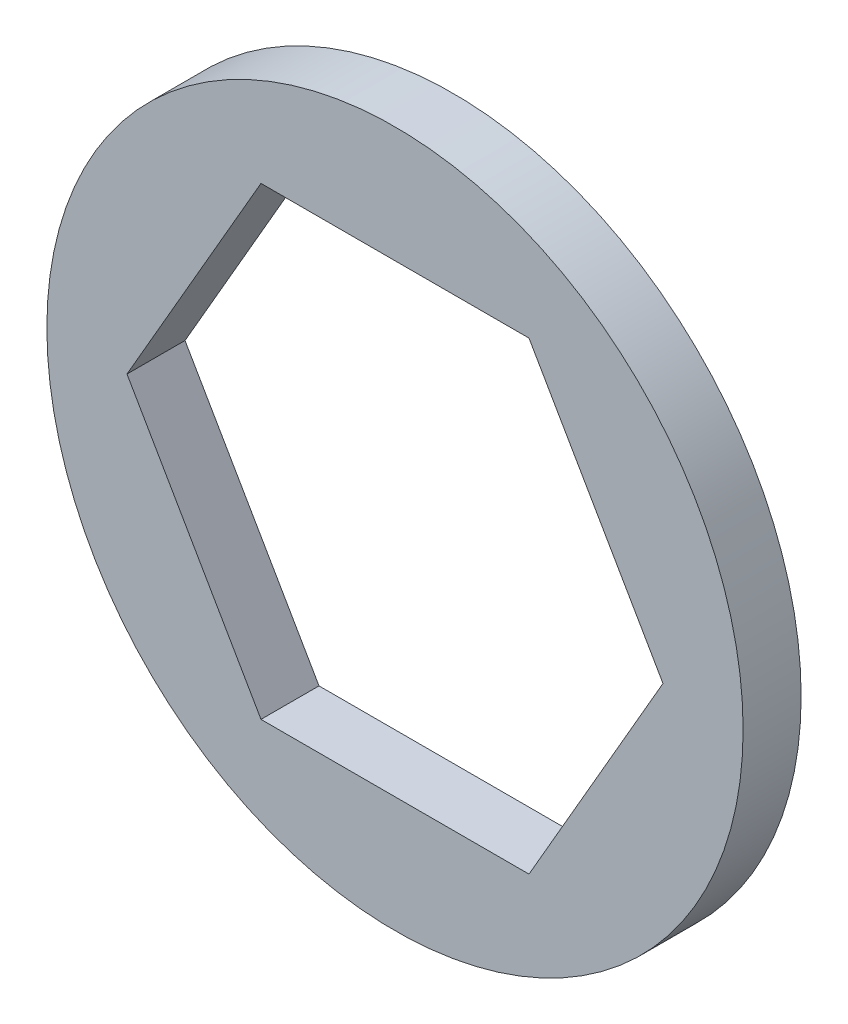
ISO-10303-21;
HEADER;
FILE_DESCRIPTION(('STEP AP214'),'2;1');
FILE_NAME('part.step','',(''),(''),'','','');
FILE_SCHEMA(('AUTOMOTIVE_DESIGN { 1 0 10303 214 1 1 1 1 }'));
ENDSEC;
DATA;
#1=APPLICATION_CONTEXT('core data for automotive mechanical design processes');
#2=APPLICATION_PROTOCOL_DEFINITION('international standard','automotive_design',2000,#1);
#3=PRODUCT_CONTEXT('',#1,'mechanical');
#4=PRODUCT('Part','Part','',(#3));
#5=PRODUCT_RELATED_PRODUCT_CATEGORY('part','',(#4));
#6=PRODUCT_DEFINITION_FORMATION('','',#4);
#7=PRODUCT_DEFINITION_CONTEXT('part definition',#1,'design');
#8=PRODUCT_DEFINITION('design','',#6,#7);
#9=PRODUCT_DEFINITION_SHAPE('','',#8);
#10=(LENGTH_UNIT() NAMED_UNIT(*) SI_UNIT(.MILLI.,.METRE.));
#11=(NAMED_UNIT(*) PLANE_ANGLE_UNIT() SI_UNIT($,.RADIAN.));
#12=(NAMED_UNIT(*) SI_UNIT($,.STERADIAN.) SOLID_ANGLE_UNIT());
#13=UNCERTAINTY_MEASURE_WITH_UNIT(LENGTH_MEASURE(1.E-05),#10,'distance_accuracy_value','');
#14=(GEOMETRIC_REPRESENTATION_CONTEXT(3) GLOBAL_UNCERTAINTY_ASSIGNED_CONTEXT((#13)) GLOBAL_UNIT_ASSIGNED_CONTEXT((#10,
#11,#12)) REPRESENTATION_CONTEXT('',''));
#15=CARTESIAN_POINT('',(0.,0.,0.));
#16=DIRECTION('',(0.,0.,1.));
#17=DIRECTION('',(1.,0.,0.));
#18=AXIS2_PLACEMENT_3D('',#15,#16,#17);
#19=CARTESIAN_POINT('',(0.,0.,1.5875));
#20=DIRECTION('',(0.,0.,1.));
#21=DIRECTION('',(1.,0.,0.));
#22=AXIS2_PLACEMENT_3D('',#19,#20,#21);
#23=PLANE('',#22);
#24=CARTESIAN_POINT('',(0.,0.,1.5875));
#25=DIRECTION('',(0.,0.,1.));
#26=DIRECTION('',(1.,0.,0.));
#27=AXIS2_PLACEMENT_3D('',#24,#25,#26);
#28=CIRCLE('',#27,9.525);
#29=CARTESIAN_POINT('',(9.525,0.,1.5875));
#30=VERTEX_POINT('',#29);
#31=EDGE_CURVE('E12',#30,#30,#28,.T.);
#32=ORIENTED_EDGE('',*,*,#31,.T.);
#33=EDGE_LOOP('',(#32));
#34=FACE_BOUND('',#33,.T.);
#35=DIRECTION('',(0.5,0.866025403784439,0.));
#36=VECTOR('',#35,1.);
#37=CARTESIAN_POINT('',(5.49926131403119,-3.175,1.5875));
#38=LINE('',#37,#36);
#39=CARTESIAN_POINT('',(3.66617420935413,-6.35,1.5875));
#40=VERTEX_POINT('',#39);
#41=CARTESIAN_POINT('',(7.33234841870825,0.,1.5875));
#42=VERTEX_POINT('',#41);
#43=EDGE_CURVE('E133',#40,#42,#38,.T.);
#44=ORIENTED_EDGE('',*,*,#43,.F.);
#45=DIRECTION('',(1.,0.,0.));
#46=VECTOR('',#45,1.);
#47=CARTESIAN_POINT('',(0.,-6.35,1.5875));
#48=LINE('',#47,#46);
#49=CARTESIAN_POINT('',(-3.66617420935412,-6.35,1.5875));
#50=VERTEX_POINT('',#49);
#51=EDGE_CURVE('E124',#50,#40,#48,.T.);
#52=ORIENTED_EDGE('',*,*,#51,.F.);
#53=DIRECTION('',(0.5,-0.866025403784439,0.));
#54=VECTOR('',#53,1.);
#55=CARTESIAN_POINT('',(-5.49926131403118,-3.175,1.5875));
#56=LINE('',#55,#54);
#57=CARTESIAN_POINT('',(-7.33234841870825,0.,1.5875));
#58=VERTEX_POINT('',#57);
#59=EDGE_CURVE('E158',#58,#50,#56,.T.);
#60=ORIENTED_EDGE('',*,*,#59,.F.);
#61=DIRECTION('',(-0.5,-0.866025403784439,0.));
#62=VECTOR('',#61,1.);
#63=CARTESIAN_POINT('',(-5.49926131403118,3.175,1.5875));
#64=LINE('',#63,#62);
#65=CARTESIAN_POINT('',(-3.66617420935412,6.35,1.5875));
#66=VERTEX_POINT('',#65);
#67=EDGE_CURVE('E155',#66,#58,#64,.T.);
#68=ORIENTED_EDGE('',*,*,#67,.F.);
#69=DIRECTION('',(-1.,0.,0.));
#70=VECTOR('',#69,1.);
#71=CARTESIAN_POINT('',(0.,6.35,1.5875));
#72=LINE('',#71,#70);
#73=CARTESIAN_POINT('',(3.66617420935412,6.35,1.5875));
#74=VERTEX_POINT('',#73);
#75=EDGE_CURVE('E150',#74,#66,#72,.T.);
#76=ORIENTED_EDGE('',*,*,#75,.F.);
#77=DIRECTION('',(-0.5,0.866025403784439,0.));
#78=VECTOR('',#77,1.);
#79=CARTESIAN_POINT('',(5.49926131403118,3.175,1.5875));
#80=LINE('',#79,#78);
#81=EDGE_CURVE('E146',#42,#74,#80,.T.);
#82=ORIENTED_EDGE('',*,*,#81,.F.);
#83=EDGE_LOOP('',(#44,#52,#60,#68,#76,#82));
#84=FACE_BOUND('',#83,.T.);
#85=ADVANCED_FACE('F70',(#34,#84),#23,.T.);
#86=CARTESIAN_POINT('',(0.,0.,0.));
#87=DIRECTION('',(0.,0.,1.));
#88=DIRECTION('',(1.,0.,0.));
#89=AXIS2_PLACEMENT_3D('',#86,#87,#88);
#90=PLANE('',#89);
#91=CARTESIAN_POINT('',(0.,0.,0.));
#92=DIRECTION('',(0.,0.,1.));
#93=DIRECTION('',(1.,0.,0.));
#94=AXIS2_PLACEMENT_3D('',#91,#92,#93);
#95=CIRCLE('',#94,9.525);
#96=CARTESIAN_POINT('',(9.525,0.,0.));
#97=VERTEX_POINT('',#96);
#98=EDGE_CURVE('E74',#97,#97,#95,.T.);
#99=ORIENTED_EDGE('',*,*,#98,.F.);
#100=EDGE_LOOP('',(#99));
#101=FACE_BOUND('',#100,.T.);
#102=DIRECTION('',(1.,0.,0.));
#103=VECTOR('',#102,1.);
#104=CARTESIAN_POINT('',(0.,-6.35,0.));
#105=LINE('',#104,#103);
#106=CARTESIAN_POINT('',(-3.66617420935412,-6.35,0.));
#107=VERTEX_POINT('',#106);
#108=CARTESIAN_POINT('',(3.66617420935413,-6.35,0.));
#109=VERTEX_POINT('',#108);
#110=EDGE_CURVE('E94',#107,#109,#105,.T.);
#111=ORIENTED_EDGE('',*,*,#110,.T.);
#112=DIRECTION('',(0.5,0.866025403784439,0.));
#113=VECTOR('',#112,1.);
#114=CARTESIAN_POINT('',(5.49926131403119,-3.175,0.));
#115=LINE('',#114,#113);
#116=CARTESIAN_POINT('',(7.33234841870825,0.,0.));
#117=VERTEX_POINT('',#116);
#118=EDGE_CURVE('E140',#109,#117,#115,.T.);
#119=ORIENTED_EDGE('',*,*,#118,.T.);
#120=DIRECTION('',(-0.5,0.866025403784439,0.));
#121=VECTOR('',#120,1.);
#122=CARTESIAN_POINT('',(5.49926131403118,3.175,0.));
#123=LINE('',#122,#121);
#124=CARTESIAN_POINT('',(3.66617420935412,6.35,0.));
#125=VERTEX_POINT('',#124);
#126=EDGE_CURVE('E165',#117,#125,#123,.T.);
#127=ORIENTED_EDGE('',*,*,#126,.T.);
#128=DIRECTION('',(-1.,0.,0.));
#129=VECTOR('',#128,1.);
#130=CARTESIAN_POINT('',(0.,6.35,0.));
#131=LINE('',#130,#129);
#132=CARTESIAN_POINT('',(-3.66617420935412,6.35,0.));
#133=VERTEX_POINT('',#132);
#134=EDGE_CURVE('E169',#125,#133,#131,.T.);
#135=ORIENTED_EDGE('',*,*,#134,.T.);
#136=DIRECTION('',(-0.5,-0.866025403784439,0.));
#137=VECTOR('',#136,1.);
#138=CARTESIAN_POINT('',(-5.49926131403118,3.175,0.));
#139=LINE('',#138,#137);
#140=CARTESIAN_POINT('',(-7.33234841870825,0.,0.));
#141=VERTEX_POINT('',#140);
#142=EDGE_CURVE('E173',#133,#141,#139,.T.);
#143=ORIENTED_EDGE('',*,*,#142,.T.);
#144=DIRECTION('',(0.5,-0.866025403784439,0.));
#145=VECTOR('',#144,1.);
#146=CARTESIAN_POINT('',(-5.49926131403118,-3.175,0.));
#147=LINE('',#146,#145);
#148=EDGE_CURVE('E134',#141,#107,#147,.T.);
#149=ORIENTED_EDGE('',*,*,#148,.T.);
#150=EDGE_LOOP('',(#111,#119,#127,#135,#143,#149));
#151=FACE_BOUND('',#150,.T.);
#152=ADVANCED_FACE('F197',(#101,#151),#90,.F.);
#153=CARTESIAN_POINT('',(0.,0.,1.5875));
#154=DIRECTION('',(0.,0.,-1.));
#155=DIRECTION('',(-1.,0.,0.));
#156=AXIS2_PLACEMENT_3D('',#153,#154,#155);
#157=CYLINDRICAL_SURFACE('',#156,9.525);
#158=ORIENTED_EDGE('',*,*,#31,.F.);
#159=EDGE_LOOP('',(#158));
#160=FACE_BOUND('',#159,.T.);
#161=ORIENTED_EDGE('',*,*,#98,.T.);
#162=EDGE_LOOP('',(#161));
#163=FACE_BOUND('',#162,.T.);
#164=ADVANCED_FACE('F72',(#160,#163),#157,.T.);
#165=CARTESIAN_POINT('',(0.,-6.35,1.5875));
#166=DIRECTION('',(0.,1.,0.));
#167=DIRECTION('',(0.,0.,1.));
#168=AXIS2_PLACEMENT_3D('',#165,#166,#167);
#169=PLANE('',#168);
#170=ORIENTED_EDGE('',*,*,#110,.F.);
#171=DIRECTION('',(0.,0.,-1.));
#172=VECTOR('',#171,1.);
#173=CARTESIAN_POINT('',(-3.66617420935412,-6.35,1.5875));
#174=LINE('',#173,#172);
#175=EDGE_CURVE('E128',#50,#107,#174,.T.);
#176=ORIENTED_EDGE('',*,*,#175,.F.);
#177=ORIENTED_EDGE('',*,*,#51,.T.);
#178=DIRECTION('',(0.,0.,-1.));
#179=VECTOR('',#178,1.);
#180=CARTESIAN_POINT('',(3.66617420935413,-6.35,1.5875));
#181=LINE('',#180,#179);
#182=EDGE_CURVE('E127',#40,#109,#181,.T.);
#183=ORIENTED_EDGE('',*,*,#182,.T.);
#184=EDGE_LOOP('',(#170,#176,#177,#183));
#185=FACE_BOUND('',#184,.T.);
#186=ADVANCED_FACE('F126',(#185),#169,.T.);
#187=CARTESIAN_POINT('',(5.49926131403119,-3.175,1.5875));
#188=DIRECTION('',(-0.866025403784439,0.5,0.));
#189=DIRECTION('',(-0.5,-0.866025403784439,0.));
#190=AXIS2_PLACEMENT_3D('',#187,#188,#189);
#191=PLANE('',#190);
#192=ORIENTED_EDGE('',*,*,#118,.F.);
#193=ORIENTED_EDGE('',*,*,#182,.F.);
#194=ORIENTED_EDGE('',*,*,#43,.T.);
#195=DIRECTION('',(0.,0.,-1.));
#196=VECTOR('',#195,1.);
#197=CARTESIAN_POINT('',(7.33234841870825,0.,1.5875));
#198=LINE('',#197,#196);
#199=EDGE_CURVE('E142',#42,#117,#198,.T.);
#200=ORIENTED_EDGE('',*,*,#199,.T.);
#201=EDGE_LOOP('',(#192,#193,#194,#200));
#202=FACE_BOUND('',#201,.T.);
#203=ADVANCED_FACE('F137',(#202),#191,.T.);
#204=CARTESIAN_POINT('',(5.49926131403118,3.175,1.5875));
#205=DIRECTION('',(-0.866025403784439,-0.5,0.));
#206=DIRECTION('',(0.5,-0.866025403784439,0.));
#207=AXIS2_PLACEMENT_3D('',#204,#205,#206);
#208=PLANE('',#207);
#209=ORIENTED_EDGE('',*,*,#126,.F.);
#210=ORIENTED_EDGE('',*,*,#199,.F.);
#211=ORIENTED_EDGE('',*,*,#81,.T.);
#212=DIRECTION('',(0.,0.,-1.));
#213=VECTOR('',#212,1.);
#214=CARTESIAN_POINT('',(3.66617420935412,6.35,1.5875));
#215=LINE('',#214,#213);
#216=EDGE_CURVE('E187',#74,#125,#215,.T.);
#217=ORIENTED_EDGE('',*,*,#216,.T.);
#218=EDGE_LOOP('',(#209,#210,#211,#217));
#219=FACE_BOUND('',#218,.T.);
#220=ADVANCED_FACE('F193',(#219),#208,.T.);
#221=CARTESIAN_POINT('',(0.,6.35,1.5875));
#222=DIRECTION('',(0.,-1.,0.));
#223=DIRECTION('',(1.,0.,0.));
#224=AXIS2_PLACEMENT_3D('',#221,#222,#223);
#225=PLANE('',#224);
#226=ORIENTED_EDGE('',*,*,#134,.F.);
#227=ORIENTED_EDGE('',*,*,#216,.F.);
#228=ORIENTED_EDGE('',*,*,#75,.T.);
#229=DIRECTION('',(0.,0.,-1.));
#230=VECTOR('',#229,1.);
#231=CARTESIAN_POINT('',(-3.66617420935412,6.35,1.5875));
#232=LINE('',#231,#230);
#233=EDGE_CURVE('E184',#66,#133,#232,.T.);
#234=ORIENTED_EDGE('',*,*,#233,.T.);
#235=EDGE_LOOP('',(#226,#227,#228,#234));
#236=FACE_BOUND('',#235,.T.);
#237=ADVANCED_FACE('F205',(#236),#225,.T.);
#238=CARTESIAN_POINT('',(-5.49926131403118,3.175,1.5875));
#239=DIRECTION('',(0.866025403784439,-0.5,0.));
#240=DIRECTION('',(0.5,0.866025403784439,0.));
#241=AXIS2_PLACEMENT_3D('',#238,#239,#240);
#242=PLANE('',#241);
#243=ORIENTED_EDGE('',*,*,#142,.F.);
#244=ORIENTED_EDGE('',*,*,#233,.F.);
#245=ORIENTED_EDGE('',*,*,#67,.T.);
#246=DIRECTION('',(0.,0.,-1.));
#247=VECTOR('',#246,1.);
#248=CARTESIAN_POINT('',(-7.33234841870825,0.,1.5875));
#249=LINE('',#248,#247);
#250=EDGE_CURVE('E86',#58,#141,#249,.T.);
#251=ORIENTED_EDGE('',*,*,#250,.T.);
#252=EDGE_LOOP('',(#243,#244,#245,#251));
#253=FACE_BOUND('',#252,.T.);
#254=ADVANCED_FACE('F203',(#253),#242,.T.);
#255=CARTESIAN_POINT('',(-5.49926131403118,-3.175,1.5875));
#256=DIRECTION('',(0.866025403784439,0.5,0.));
#257=DIRECTION('',(-0.5,0.866025403784439,0.));
#258=AXIS2_PLACEMENT_3D('',#255,#256,#257);
#259=PLANE('',#258);
#260=ORIENTED_EDGE('',*,*,#148,.F.);
#261=ORIENTED_EDGE('',*,*,#250,.F.);
#262=ORIENTED_EDGE('',*,*,#59,.T.);
#263=ORIENTED_EDGE('',*,*,#175,.T.);
#264=EDGE_LOOP('',(#260,#261,#262,#263));
#265=FACE_BOUND('',#264,.T.);
#266=ADVANCED_FACE('F199',(#265),#259,.T.);
#267=CLOSED_SHELL('',(#85,#152,#164,#186,#203,#220,#237,#254,#266));
#268=MANIFOLD_SOLID_BREP('B2',#267);
#269=ADVANCED_BREP_SHAPE_REPRESENTATION('',(#18,#268),#14);
#270=SHAPE_DEFINITION_REPRESENTATION(#9,#269);
ENDSEC;
END-ISO-10303-21;
